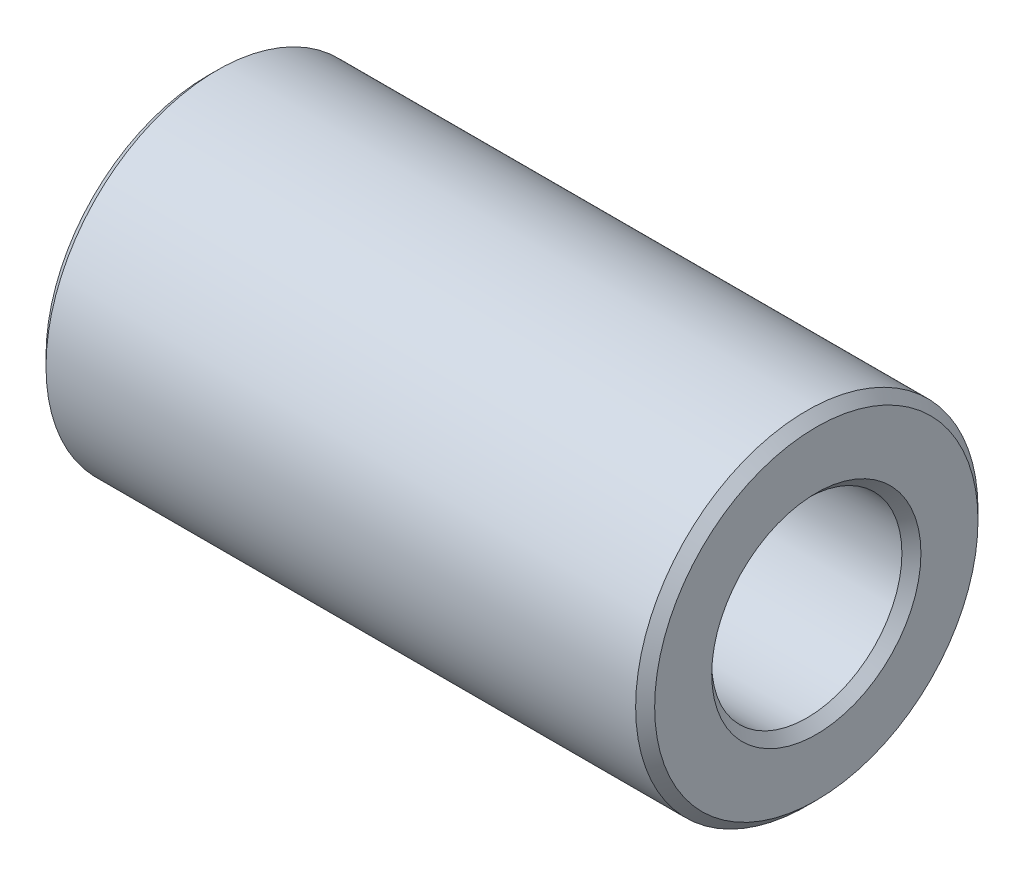
ISO-10303-21;
HEADER;
FILE_DESCRIPTION(('STEP AP214'),'2;1');
FILE_NAME('part.step','',(''),(''),'','','');
FILE_SCHEMA(('AUTOMOTIVE_DESIGN { 1 0 10303 214 1 1 1 1 }'));
ENDSEC;
DATA;
#1=APPLICATION_CONTEXT('core data for automotive mechanical design processes');
#2=APPLICATION_PROTOCOL_DEFINITION('international standard','automotive_design',2000,#1);
#3=PRODUCT_CONTEXT('',#1,'mechanical');
#4=PRODUCT('Part','Part','',(#3));
#5=PRODUCT_RELATED_PRODUCT_CATEGORY('part','',(#4));
#6=PRODUCT_DEFINITION_FORMATION('','',#4);
#7=PRODUCT_DEFINITION_CONTEXT('part definition',#1,'design');
#8=PRODUCT_DEFINITION('design','',#6,#7);
#9=PRODUCT_DEFINITION_SHAPE('','',#8);
#10=(LENGTH_UNIT() NAMED_UNIT(*) SI_UNIT(.MILLI.,.METRE.));
#11=(NAMED_UNIT(*) PLANE_ANGLE_UNIT() SI_UNIT($,.RADIAN.));
#12=(NAMED_UNIT(*) SI_UNIT($,.STERADIAN.) SOLID_ANGLE_UNIT());
#13=UNCERTAINTY_MEASURE_WITH_UNIT(LENGTH_MEASURE(1.E-05),#10,'distance_accuracy_value','');
#14=(GEOMETRIC_REPRESENTATION_CONTEXT(3) GLOBAL_UNCERTAINTY_ASSIGNED_CONTEXT((#13)) GLOBAL_UNIT_ASSIGNED_CONTEXT((#10,
#11,#12)) REPRESENTATION_CONTEXT('',''));
#15=CARTESIAN_POINT('',(0.,0.,0.));
#16=DIRECTION('',(0.,0.,1.));
#17=DIRECTION('',(1.,0.,0.));
#18=AXIS2_PLACEMENT_3D('',#15,#16,#17);
#19=CARTESIAN_POINT('',(0.,0.,0.));
#20=DIRECTION('',(-1.,0.,0.));
#21=DIRECTION('',(0.,0.,1.));
#22=AXIS2_PLACEMENT_3D('',#19,#20,#21);
#23=CYLINDRICAL_SURFACE('',#22,5.);
#24=CARTESIAN_POINT('',(15.5,0.,0.));
#25=DIRECTION('',(1.,0.,0.));
#26=DIRECTION('',(0.,0.,-1.));
#27=AXIS2_PLACEMENT_3D('',#24,#25,#26);
#28=CIRCLE('',#27,5.);
#29=CARTESIAN_POINT('',(15.5,0.,-5.));
#30=VERTEX_POINT('',#29);
#31=EDGE_CURVE('E41',#30,#30,#28,.T.);
#32=ORIENTED_EDGE('',*,*,#31,.T.);
#33=EDGE_LOOP('',(#32));
#34=FACE_BOUND('',#33,.T.);
#35=CARTESIAN_POINT('',(-15.5,0.,0.));
#36=DIRECTION('',(-1.,0.,0.));
#37=DIRECTION('',(0.,0.,1.));
#38=AXIS2_PLACEMENT_3D('',#35,#36,#37);
#39=CIRCLE('',#38,5.);
#40=CARTESIAN_POINT('',(-15.5,0.,5.));
#41=VERTEX_POINT('',#40);
#42=EDGE_CURVE('E45',#41,#41,#39,.T.);
#43=ORIENTED_EDGE('',*,*,#42,.T.);
#44=EDGE_LOOP('',(#43));
#45=FACE_BOUND('',#44,.T.);
#46=ADVANCED_FACE('F31',(#34,#45),#23,.F.);
#47=CARTESIAN_POINT('',(-16.,5.,0.));
#48=DIRECTION('',(-1.,0.,0.));
#49=DIRECTION('',(0.,0.,1.));
#50=AXIS2_PLACEMENT_3D('',#47,#48,#49);
#51=PLANE('',#50);
#52=CARTESIAN_POINT('',(-16.,0.,0.));
#53=DIRECTION('',(-1.,0.,0.));
#54=DIRECTION('',(0.,0.,1.));
#55=AXIS2_PLACEMENT_3D('',#52,#53,#54);
#56=CIRCLE('',#55,5.50000000000001);
#57=CARTESIAN_POINT('',(-16.,0.,5.50000000000001));
#58=VERTEX_POINT('',#57);
#59=EDGE_CURVE('E10',#58,#58,#56,.F.);
#60=ORIENTED_EDGE('',*,*,#59,.T.);
#61=EDGE_LOOP('',(#60));
#62=FACE_BOUND('',#61,.T.);
#63=CARTESIAN_POINT('',(-16.,0.,0.));
#64=DIRECTION('',(-1.,0.,0.));
#65=DIRECTION('',(0.,0.,1.));
#66=AXIS2_PLACEMENT_3D('',#63,#64,#65);
#67=CIRCLE('',#66,8.49999999999999);
#68=CARTESIAN_POINT('',(-16.,0.,8.49999999999999));
#69=VERTEX_POINT('',#68);
#70=EDGE_CURVE('E37',#69,#69,#67,.T.);
#71=ORIENTED_EDGE('',*,*,#70,.T.);
#72=EDGE_LOOP('',(#71));
#73=FACE_BOUND('',#72,.T.);
#74=ADVANCED_FACE('F77',(#62,#73),#51,.T.);
#75=CARTESIAN_POINT('',(0.,0.,0.));
#76=DIRECTION('',(-1.,0.,0.));
#77=DIRECTION('',(0.,0.,1.));
#78=AXIS2_PLACEMENT_3D('',#75,#76,#77);
#79=CYLINDRICAL_SURFACE('',#78,9.);
#80=CARTESIAN_POINT('',(15.5,0.,0.));
#81=DIRECTION('',(1.,0.,0.));
#82=DIRECTION('',(0.,0.,-1.));
#83=AXIS2_PLACEMENT_3D('',#80,#81,#82);
#84=CIRCLE('',#83,9.);
#85=CARTESIAN_POINT('',(15.5,0.,-9.));
#86=VERTEX_POINT('',#85);
#87=EDGE_CURVE('E56',#86,#86,#84,.F.);
#88=ORIENTED_EDGE('',*,*,#87,.T.);
#89=EDGE_LOOP('',(#88));
#90=FACE_BOUND('',#89,.T.);
#91=CARTESIAN_POINT('',(-15.5,0.,0.));
#92=DIRECTION('',(-1.,0.,0.));
#93=DIRECTION('',(0.,0.,1.));
#94=AXIS2_PLACEMENT_3D('',#91,#92,#93);
#95=CIRCLE('',#94,9.);
#96=CARTESIAN_POINT('',(-15.5,0.,9.));
#97=VERTEX_POINT('',#96);
#98=EDGE_CURVE('E59',#97,#97,#95,.F.);
#99=ORIENTED_EDGE('',*,*,#98,.T.);
#100=EDGE_LOOP('',(#99));
#101=FACE_BOUND('',#100,.T.);
#102=ADVANCED_FACE('F63',(#90,#101),#79,.T.);
#103=CARTESIAN_POINT('',(16.,9.00000000000001,0.));
#104=DIRECTION('',(1.,0.,0.));
#105=DIRECTION('',(0.,0.,-1.));
#106=AXIS2_PLACEMENT_3D('',#103,#104,#105);
#107=PLANE('',#106);
#108=CARTESIAN_POINT('',(16.,0.,0.));
#109=DIRECTION('',(1.,0.,0.));
#110=DIRECTION('',(0.,0.,-1.));
#111=AXIS2_PLACEMENT_3D('',#108,#109,#110);
#112=CIRCLE('',#111,8.5);
#113=CARTESIAN_POINT('',(16.,0.,-8.5));
#114=VERTEX_POINT('',#113);
#115=EDGE_CURVE('E50',#114,#114,#112,.T.);
#116=ORIENTED_EDGE('',*,*,#115,.T.);
#117=EDGE_LOOP('',(#116));
#118=FACE_BOUND('',#117,.T.);
#119=CARTESIAN_POINT('',(16.,0.,0.));
#120=DIRECTION('',(1.,0.,0.));
#121=DIRECTION('',(0.,0.,-1.));
#122=AXIS2_PLACEMENT_3D('',#119,#120,#121);
#123=CIRCLE('',#122,5.50000000000001);
#124=CARTESIAN_POINT('',(16.,0.,-5.50000000000001));
#125=VERTEX_POINT('',#124);
#126=EDGE_CURVE('E53',#125,#125,#123,.F.);
#127=ORIENTED_EDGE('',*,*,#126,.T.);
#128=EDGE_LOOP('',(#127));
#129=FACE_BOUND('',#128,.T.);
#130=ADVANCED_FACE('F93',(#118,#129),#107,.T.);
#131=CARTESIAN_POINT('',(15.5,0.,0.));
#132=DIRECTION('',(-1.,0.,0.));
#133=DIRECTION('',(0.,0.,1.));
#134=AXIS2_PLACEMENT_3D('',#131,#132,#133);
#135=CONICAL_SURFACE('',#134,9.,0.785398163397443);
#136=ORIENTED_EDGE('',*,*,#115,.F.);
#137=EDGE_LOOP('',(#136));
#138=FACE_BOUND('',#137,.T.);
#139=ORIENTED_EDGE('',*,*,#87,.F.);
#140=EDGE_LOOP('',(#139));
#141=FACE_BOUND('',#140,.T.);
#142=ADVANCED_FACE('F89',(#138,#141),#135,.T.);
#143=CARTESIAN_POINT('',(16.,0.,0.));
#144=DIRECTION('',(1.,0.,0.));
#145=DIRECTION('',(0.,0.,-1.));
#146=AXIS2_PLACEMENT_3D('',#143,#144,#145);
#147=CONICAL_SURFACE('',#146,5.50000000000001,0.785398163397453);
#148=ORIENTED_EDGE('',*,*,#31,.F.);
#149=EDGE_LOOP('',(#148));
#150=FACE_BOUND('',#149,.T.);
#151=ORIENTED_EDGE('',*,*,#126,.F.);
#152=EDGE_LOOP('',(#151));
#153=FACE_BOUND('',#152,.T.);
#154=ADVANCED_FACE('F73',(#150,#153),#147,.F.);
#155=CARTESIAN_POINT('',(-15.5,0.,0.));
#156=DIRECTION('',(-1.,0.,0.));
#157=DIRECTION('',(0.,0.,1.));
#158=AXIS2_PLACEMENT_3D('',#155,#156,#157);
#159=CONICAL_SURFACE('',#158,5.,0.785398163397443);
#160=ORIENTED_EDGE('',*,*,#59,.F.);
#161=EDGE_LOOP('',(#160));
#162=FACE_BOUND('',#161,.T.);
#163=ORIENTED_EDGE('',*,*,#42,.F.);
#164=EDGE_LOOP('',(#163));
#165=FACE_BOUND('',#164,.T.);
#166=ADVANCED_FACE('F68',(#162,#165),#159,.F.);
#167=CARTESIAN_POINT('',(-16.,0.,0.));
#168=DIRECTION('',(1.,0.,0.));
#169=DIRECTION('',(0.,0.,-1.));
#170=AXIS2_PLACEMENT_3D('',#167,#168,#169);
#171=CONICAL_SURFACE('',#170,8.49999999999999,0.785398163397453);
#172=ORIENTED_EDGE('',*,*,#98,.F.);
#173=EDGE_LOOP('',(#172));
#174=FACE_BOUND('',#173,.T.);
#175=ORIENTED_EDGE('',*,*,#70,.F.);
#176=EDGE_LOOP('',(#175));
#177=FACE_BOUND('',#176,.T.);
#178=ADVANCED_FACE('F65',(#174,#177),#171,.T.);
#179=CLOSED_SHELL('',(#46,#74,#102,#130,#142,#154,#166,#178));
#180=MANIFOLD_SOLID_BREP('B2',#179);
#181=ADVANCED_BREP_SHAPE_REPRESENTATION('',(#18,#180),#14);
#182=SHAPE_DEFINITION_REPRESENTATION(#9,#181);
ENDSEC;
END-ISO-10303-21;
